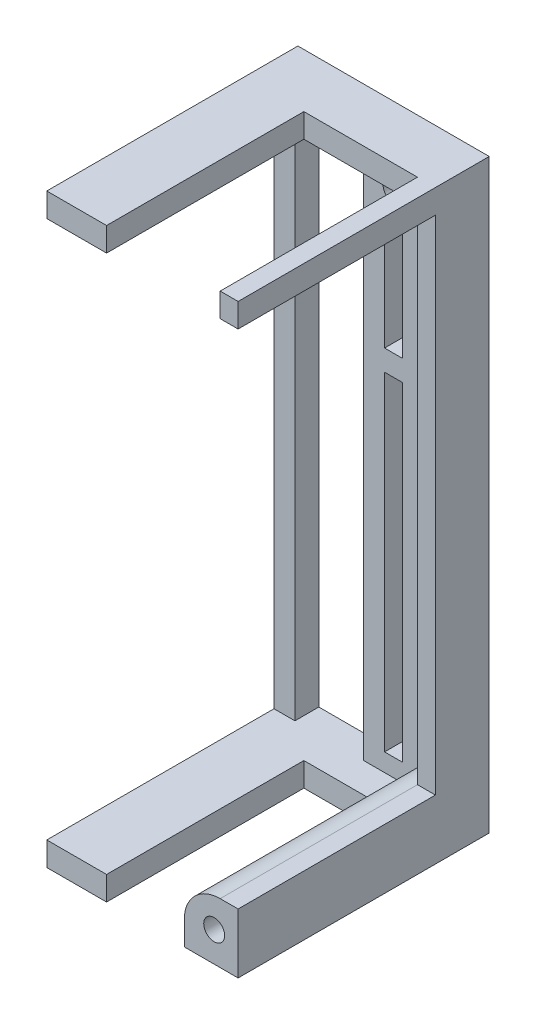
ISO-10303-21;
HEADER;
FILE_DESCRIPTION(('STEP AP214'),'2;1');
FILE_NAME('part.step','',(''),(''),'','','');
FILE_SCHEMA(('AUTOMOTIVE_DESIGN { 1 0 10303 214 1 1 1 1 }'));
ENDSEC;
DATA;
#1=APPLICATION_CONTEXT('core data for automotive mechanical design processes');
#2=APPLICATION_PROTOCOL_DEFINITION('international standard','automotive_design',2000,#1);
#3=PRODUCT_CONTEXT('',#1,'mechanical');
#4=PRODUCT('Part','Part','',(#3));
#5=PRODUCT_RELATED_PRODUCT_CATEGORY('part','',(#4));
#6=PRODUCT_DEFINITION_FORMATION('','',#4);
#7=PRODUCT_DEFINITION_CONTEXT('part definition',#1,'design');
#8=PRODUCT_DEFINITION('design','',#6,#7);
#9=PRODUCT_DEFINITION_SHAPE('','',#8);
#10=(LENGTH_UNIT() NAMED_UNIT(*) SI_UNIT(.MILLI.,.METRE.));
#11=(NAMED_UNIT(*) PLANE_ANGLE_UNIT() SI_UNIT($,.RADIAN.));
#12=(NAMED_UNIT(*) SI_UNIT($,.STERADIAN.) SOLID_ANGLE_UNIT());
#13=UNCERTAINTY_MEASURE_WITH_UNIT(LENGTH_MEASURE(1.E-05),#10,'distance_accuracy_value','');
#14=(GEOMETRIC_REPRESENTATION_CONTEXT(3) GLOBAL_UNCERTAINTY_ASSIGNED_CONTEXT((#13)) GLOBAL_UNIT_ASSIGNED_CONTEXT((#10,
#11,#12)) REPRESENTATION_CONTEXT('',''));
#15=CARTESIAN_POINT('',(0.,0.,0.));
#16=DIRECTION('',(0.,0.,1.));
#17=DIRECTION('',(1.,0.,0.));
#18=AXIS2_PLACEMENT_3D('',#15,#16,#17);
#19=CARTESIAN_POINT('',(0.,0.,-80.));
#20=DIRECTION('',(0.,0.,-1.));
#21=DIRECTION('',(1.,0.,0.));
#22=AXIS2_PLACEMENT_3D('',#19,#20,#21);
#23=PLANE('',#22);
#24=CARTESIAN_POINT('',(28.,5.,-80.));
#25=DIRECTION('',(0.,0.,-1.));
#26=DIRECTION('',(-1.,0.,0.));
#27=AXIS2_PLACEMENT_3D('',#24,#25,#26);
#28=CIRCLE('',#27,1.75);
#29=CARTESIAN_POINT('',(26.25,5.,-80.));
#30=VERTEX_POINT('',#29);
#31=EDGE_CURVE('E350',#30,#30,#28,.T.);
#32=ORIENTED_EDGE('',*,*,#31,.F.);
#33=EDGE_LOOP('',(#32));
#34=FACE_BOUND('',#33,.T.);
#35=DIRECTION('',(0.,1.,0.));
#36=VECTOR('',#35,1.);
#37=CARTESIAN_POINT('',(32.,0.,-80.));
#38=LINE('',#37,#36);
#39=CARTESIAN_POINT('',(32.,0.,-80.));
#40=VERTEX_POINT('',#39);
#41=CARTESIAN_POINT('',(32.,98.,-80.));
#42=VERTEX_POINT('',#41);
#43=EDGE_CURVE('E449',#40,#42,#38,.T.);
#44=ORIENTED_EDGE('',*,*,#43,.F.);
#45=DIRECTION('',(1.,0.,0.));
#46=VECTOR('',#45,1.);
#47=CARTESIAN_POINT('',(0.,0.,-80.));
#48=LINE('',#47,#46);
#49=CARTESIAN_POINT('',(0.,0.,-80.));
#50=VERTEX_POINT('',#49);
#51=EDGE_CURVE('E459',#50,#40,#48,.T.);
#52=ORIENTED_EDGE('',*,*,#51,.F.);
#53=DIRECTION('',(0.,1.,0.));
#54=VECTOR('',#53,1.);
#55=CARTESIAN_POINT('',(0.,0.,-80.));
#56=LINE('',#55,#54);
#57=CARTESIAN_POINT('',(0.,98.,-80.));
#58=VERTEX_POINT('',#57);
#59=EDGE_CURVE('E456',#50,#58,#56,.T.);
#60=ORIENTED_EDGE('',*,*,#59,.T.);
#61=DIRECTION('',(1.,0.,0.));
#62=VECTOR('',#61,1.);
#63=CARTESIAN_POINT('',(0.,98.,-80.));
#64=LINE('',#63,#62);
#65=EDGE_CURVE('E452',#58,#42,#64,.T.);
#66=ORIENTED_EDGE('',*,*,#65,.T.);
#67=EDGE_LOOP('',(#44,#52,#60,#66));
#68=FACE_BOUND('',#67,.T.);
#69=DIRECTION('',(0.,1.,0.));
#70=VECTOR('',#69,1.);
#71=CARTESIAN_POINT('',(21.5,0.,-80.));
#72=LINE('',#71,#70);
#73=CARTESIAN_POINT('',(21.5,7.,-80.));
#74=VERTEX_POINT('',#73);
#75=CARTESIAN_POINT('',(21.5,62.,-80.));
#76=VERTEX_POINT('',#75);
#77=EDGE_CURVE('E462',#74,#76,#72,.T.);
#78=ORIENTED_EDGE('',*,*,#77,.T.);
#79=DIRECTION('',(1.,0.,0.));
#80=VECTOR('',#79,1.);
#81=CARTESIAN_POINT('',(0.,62.,-80.));
#82=LINE('',#81,#80);
#83=CARTESIAN_POINT('',(18.5,62.,-80.));
#84=VERTEX_POINT('',#83);
#85=EDGE_CURVE('E471',#84,#76,#82,.T.);
#86=ORIENTED_EDGE('',*,*,#85,.F.);
#87=DIRECTION('',(0.,1.,0.));
#88=VECTOR('',#87,1.);
#89=CARTESIAN_POINT('',(18.5,0.,-80.));
#90=LINE('',#89,#88);
#91=CARTESIAN_POINT('',(18.5,7.,-80.));
#92=VERTEX_POINT('',#91);
#93=EDGE_CURVE('E468',#92,#84,#90,.T.);
#94=ORIENTED_EDGE('',*,*,#93,.F.);
#95=DIRECTION('',(-1.,0.,0.));
#96=VECTOR('',#95,1.);
#97=CARTESIAN_POINT('',(0.,7.,-80.));
#98=LINE('',#97,#96);
#99=EDGE_CURVE('E465',#74,#92,#98,.T.);
#100=ORIENTED_EDGE('',*,*,#99,.F.);
#101=EDGE_LOOP('',(#78,#86,#94,#100));
#102=FACE_BOUND('',#101,.T.);
#103=CARTESIAN_POINT('',(20.,89.,-80.));
#104=DIRECTION('',(0.,0.,1.));
#105=DIRECTION('',(1.,0.,0.));
#106=AXIS2_PLACEMENT_3D('',#103,#104,#105);
#107=CIRCLE('',#106,1.75);
#108=CARTESIAN_POINT('',(21.75,89.,-80.));
#109=VERTEX_POINT('',#108);
#110=EDGE_CURVE('E474',#109,#109,#107,.T.);
#111=ORIENTED_EDGE('',*,*,#110,.T.);
#112=EDGE_LOOP('',(#111));
#113=FACE_BOUND('',#112,.T.);
#114=DIRECTION('',(0.,-1.,0.));
#115=VECTOR('',#114,1.);
#116=CARTESIAN_POINT('',(29.,0.,-80.));
#117=LINE('',#116,#115);
#118=CARTESIAN_POINT('',(29.,94.,-80.));
#119=VERTEX_POINT('',#118);
#120=CARTESIAN_POINT('',(29.,10.,-80.));
#121=VERTEX_POINT('',#120);
#122=EDGE_CURVE('E337',#119,#121,#117,.T.);
#123=ORIENTED_EDGE('',*,*,#122,.F.);
#124=DIRECTION('',(1.,0.,0.));
#125=VECTOR('',#124,1.);
#126=CARTESIAN_POINT('',(0.,94.,-80.));
#127=LINE('',#126,#125);
#128=CARTESIAN_POINT('',(25.,94.,-80.));
#129=VERTEX_POINT('',#128);
#130=EDGE_CURVE('E334',#129,#119,#127,.T.);
#131=ORIENTED_EDGE('',*,*,#130,.F.);
#132=DIRECTION('',(0.,-1.,0.));
#133=VECTOR('',#132,1.);
#134=CARTESIAN_POINT('',(25.,0.,-80.));
#135=LINE('',#134,#133);
#136=CARTESIAN_POINT('',(25.,10.,-80.));
#137=VERTEX_POINT('',#136);
#138=EDGE_CURVE('E330',#129,#137,#135,.T.);
#139=ORIENTED_EDGE('',*,*,#138,.T.);
#140=DIRECTION('',(1.,0.,0.));
#141=VECTOR('',#140,1.);
#142=CARTESIAN_POINT('',(0.,10.,-80.));
#143=LINE('',#142,#141);
#144=EDGE_CURVE('E327',#137,#121,#143,.T.);
#145=ORIENTED_EDGE('',*,*,#144,.T.);
#146=EDGE_LOOP('',(#123,#131,#139,#145));
#147=FACE_BOUND('',#146,.T.);
#148=DIRECTION('',(1.,0.,0.));
#149=VECTOR('',#148,1.);
#150=CARTESIAN_POINT('',(0.,84.5,-80.));
#151=LINE('',#150,#149);
#152=CARTESIAN_POINT('',(18.5,84.5,-80.));
#153=VERTEX_POINT('',#152);
#154=CARTESIAN_POINT('',(21.5,84.5,-80.));
#155=VERTEX_POINT('',#154);
#156=EDGE_CURVE('E306',#153,#155,#151,.T.);
#157=ORIENTED_EDGE('',*,*,#156,.F.);
#158=DIRECTION('',(0.,1.,0.));
#159=VECTOR('',#158,1.);
#160=CARTESIAN_POINT('',(18.5,0.,-80.));
#161=LINE('',#160,#159);
#162=CARTESIAN_POINT('',(18.5,65.5,-80.));
#163=VERTEX_POINT('',#162);
#164=EDGE_CURVE('E304',#163,#153,#161,.T.);
#165=ORIENTED_EDGE('',*,*,#164,.F.);
#166=DIRECTION('',(1.,0.,0.));
#167=VECTOR('',#166,1.);
#168=CARTESIAN_POINT('',(0.,65.5,-80.));
#169=LINE('',#168,#167);
#170=CARTESIAN_POINT('',(21.5,65.5,-80.));
#171=VERTEX_POINT('',#170);
#172=EDGE_CURVE('E300',#163,#171,#169,.T.);
#173=ORIENTED_EDGE('',*,*,#172,.T.);
#174=DIRECTION('',(0.,1.,0.));
#175=VECTOR('',#174,1.);
#176=CARTESIAN_POINT('',(21.5,0.,-80.));
#177=LINE('',#176,#175);
#178=EDGE_CURVE('E297',#171,#155,#177,.T.);
#179=ORIENTED_EDGE('',*,*,#178,.T.);
#180=EDGE_LOOP('',(#157,#165,#173,#179));
#181=FACE_BOUND('',#180,.T.);
#182=DIRECTION('',(-1.,0.,0.));
#183=VECTOR('',#182,1.);
#184=CARTESIAN_POINT('',(0.,4.,-80.));
#185=LINE('',#184,#183);
#186=CARTESIAN_POINT('',(15.,4.,-80.));
#187=VERTEX_POINT('',#186);
#188=CARTESIAN_POINT('',(3.49999999999999,4.,-80.));
#189=VERTEX_POINT('',#188);
#190=EDGE_CURVE('E271',#187,#189,#185,.T.);
#191=ORIENTED_EDGE('',*,*,#190,.F.);
#192=DIRECTION('',(0.,-1.,0.));
#193=VECTOR('',#192,1.);
#194=CARTESIAN_POINT('',(15.,0.,-80.));
#195=LINE('',#194,#193);
#196=CARTESIAN_POINT('',(15.,94.,-80.));
#197=VERTEX_POINT('',#196);
#198=EDGE_CURVE('E282',#197,#187,#195,.T.);
#199=ORIENTED_EDGE('',*,*,#198,.F.);
#200=DIRECTION('',(1.,0.,0.));
#201=VECTOR('',#200,1.);
#202=CARTESIAN_POINT('',(0.,94.,-80.));
#203=LINE('',#202,#201);
#204=CARTESIAN_POINT('',(3.5,94.,-80.));
#205=VERTEX_POINT('',#204);
#206=EDGE_CURVE('E264',#205,#197,#203,.T.);
#207=ORIENTED_EDGE('',*,*,#206,.F.);
#208=DIRECTION('',(0.,-1.,0.));
#209=VECTOR('',#208,1.);
#210=CARTESIAN_POINT('',(3.49999999999999,0.,-80.));
#211=LINE('',#210,#209);
#212=EDGE_CURVE('E274',#205,#189,#211,.T.);
#213=ORIENTED_EDGE('',*,*,#212,.T.);
#214=EDGE_LOOP('',(#191,#199,#207,#213));
#215=FACE_BOUND('',#214,.T.);
#216=ADVANCED_FACE('F43',(#34,#68,#102,#113,#147,#181,#215),#23,.T.);
#217=CARTESIAN_POINT('',(0.,0.,-76.));
#218=DIRECTION('',(0.,0.,-1.));
#219=DIRECTION('',(1.,0.,0.));
#220=AXIS2_PLACEMENT_3D('',#217,#218,#219);
#221=PLANE('',#220);
#222=DIRECTION('',(0.,-1.,0.));
#223=VECTOR('',#222,1.);
#224=CARTESIAN_POINT('',(3.49999999999999,0.,-76.));
#225=LINE('',#224,#223);
#226=CARTESIAN_POINT('',(3.49999999999999,94.,-76.));
#227=VERTEX_POINT('',#226);
#228=CARTESIAN_POINT('',(3.49999999999999,4.,-76.));
#229=VERTEX_POINT('',#228);
#230=EDGE_CURVE('E287',#227,#229,#225,.T.);
#231=ORIENTED_EDGE('',*,*,#230,.F.);
#232=DIRECTION('',(1.,0.,0.));
#233=VECTOR('',#232,1.);
#234=CARTESIAN_POINT('',(0.,94.,-76.));
#235=LINE('',#234,#233);
#236=CARTESIAN_POINT('',(0.,94.,-76.));
#237=VERTEX_POINT('',#236);
#238=EDGE_CURVE('E267',#237,#227,#235,.T.);
#239=ORIENTED_EDGE('',*,*,#238,.F.);
#240=DIRECTION('',(0.,1.,0.));
#241=VECTOR('',#240,1.);
#242=CARTESIAN_POINT('',(0.,0.,-76.));
#243=LINE('',#242,#241);
#244=CARTESIAN_POINT('',(0.,4.,-76.));
#245=VERTEX_POINT('',#244);
#246=EDGE_CURVE('E440',#245,#237,#243,.T.);
#247=ORIENTED_EDGE('',*,*,#246,.F.);
#248=DIRECTION('',(1.,0.,0.));
#249=VECTOR('',#248,1.);
#250=CARTESIAN_POINT('',(0.,4.,-76.));
#251=LINE('',#250,#249);
#252=EDGE_CURVE('E419',#245,#229,#251,.T.);
#253=ORIENTED_EDGE('',*,*,#252,.T.);
#254=EDGE_LOOP('',(#231,#239,#247,#253));
#255=FACE_BOUND('',#254,.T.);
#256=ADVANCED_FACE('F600',(#255),#221,.F.);
#257=CARTESIAN_POINT('',(15.,4.,-76.));
#258=VERTEX_POINT('',#257);
#259=CARTESIAN_POINT('',(23.,4.,-76.));
#260=VERTEX_POINT('',#259);
#261=EDGE_CURVE('E435',#258,#260,#251,.T.);
#262=ORIENTED_EDGE('',*,*,#261,.T.);
#263=CARTESIAN_POINT('',(29.,4.,-76.));
#264=DIRECTION('',(0.,0.,1.));
#265=DIRECTION('',(1.,0.,0.));
#266=AXIS2_PLACEMENT_3D('',#263,#264,#265);
#267=CIRCLE('',#266,6.);
#268=CARTESIAN_POINT('',(29.,10.,-76.));
#269=VERTEX_POINT('',#268);
#270=EDGE_CURVE('E11',#260,#269,#267,.F.);
#271=ORIENTED_EDGE('',*,*,#270,.T.);
#272=DIRECTION('',(1.,0.,0.));
#273=VECTOR('',#272,1.);
#274=CARTESIAN_POINT('',(0.,10.,-76.));
#275=LINE('',#274,#273);
#276=CARTESIAN_POINT('',(25.,10.,-76.));
#277=VERTEX_POINT('',#276);
#278=EDGE_CURVE('E341',#277,#269,#275,.T.);
#279=ORIENTED_EDGE('',*,*,#278,.F.);
#280=DIRECTION('',(0.,-1.,0.));
#281=VECTOR('',#280,1.);
#282=CARTESIAN_POINT('',(25.,0.,-76.));
#283=LINE('',#282,#281);
#284=CARTESIAN_POINT('',(25.,94.,-76.));
#285=VERTEX_POINT('',#284);
#286=EDGE_CURVE('E331',#285,#277,#283,.T.);
#287=ORIENTED_EDGE('',*,*,#286,.F.);
#288=CARTESIAN_POINT('',(15.,94.,-76.));
#289=VERTEX_POINT('',#288);
#290=EDGE_CURVE('E413',#289,#285,#235,.T.);
#291=ORIENTED_EDGE('',*,*,#290,.F.);
#292=DIRECTION('',(0.,-1.,0.));
#293=VECTOR('',#292,1.);
#294=CARTESIAN_POINT('',(15.,0.,-76.));
#295=LINE('',#294,#293);
#296=EDGE_CURVE('E280',#289,#258,#295,.T.);
#297=ORIENTED_EDGE('',*,*,#296,.T.);
#298=EDGE_LOOP('',(#262,#271,#279,#287,#291,#297));
#299=FACE_BOUND('',#298,.T.);
#300=DIRECTION('',(0.,1.,0.));
#301=VECTOR('',#300,1.);
#302=CARTESIAN_POINT('',(21.5,0.,-76.));
#303=LINE('',#302,#301);
#304=CARTESIAN_POINT('',(21.5,7.,-76.));
#305=VERTEX_POINT('',#304);
#306=CARTESIAN_POINT('',(21.5,62.,-76.));
#307=VERTEX_POINT('',#306);
#308=EDGE_CURVE('E480',#305,#307,#303,.T.);
#309=ORIENTED_EDGE('',*,*,#308,.F.);
#310=DIRECTION('',(-1.,0.,0.));
#311=VECTOR('',#310,1.);
#312=CARTESIAN_POINT('',(0.,7.,-76.));
#313=LINE('',#312,#311);
#314=CARTESIAN_POINT('',(18.5,7.,-76.));
#315=VERTEX_POINT('',#314);
#316=EDGE_CURVE('E483',#305,#315,#313,.T.);
#317=ORIENTED_EDGE('',*,*,#316,.T.);
#318=DIRECTION('',(0.,1.,0.));
#319=VECTOR('',#318,1.);
#320=CARTESIAN_POINT('',(18.5,0.,-76.));
#321=LINE('',#320,#319);
#322=CARTESIAN_POINT('',(18.5,62.,-76.));
#323=VERTEX_POINT('',#322);
#324=EDGE_CURVE('E486',#315,#323,#321,.T.);
#325=ORIENTED_EDGE('',*,*,#324,.T.);
#326=DIRECTION('',(1.,0.,0.));
#327=VECTOR('',#326,1.);
#328=CARTESIAN_POINT('',(0.,62.,-76.));
#329=LINE('',#328,#327);
#330=EDGE_CURVE('E489',#323,#307,#329,.T.);
#331=ORIENTED_EDGE('',*,*,#330,.T.);
#332=EDGE_LOOP('',(#309,#317,#325,#331));
#333=FACE_BOUND('',#332,.T.);
#334=CARTESIAN_POINT('',(20.,89.,-76.));
#335=DIRECTION('',(0.,0.,1.));
#336=DIRECTION('',(1.,0.,0.));
#337=AXIS2_PLACEMENT_3D('',#334,#335,#336);
#338=CIRCLE('',#337,1.75);
#339=CARTESIAN_POINT('',(21.75,89.,-76.));
#340=VERTEX_POINT('',#339);
#341=EDGE_CURVE('E453',#340,#340,#338,.T.);
#342=ORIENTED_EDGE('',*,*,#341,.F.);
#343=EDGE_LOOP('',(#342));
#344=FACE_BOUND('',#343,.T.);
#345=DIRECTION('',(0.,1.,0.));
#346=VECTOR('',#345,1.);
#347=CARTESIAN_POINT('',(21.5,0.,-76.));
#348=LINE('',#347,#346);
#349=CARTESIAN_POINT('',(21.5,65.5,-76.));
#350=VERTEX_POINT('',#349);
#351=CARTESIAN_POINT('',(21.5,84.5,-76.));
#352=VERTEX_POINT('',#351);
#353=EDGE_CURVE('E310',#350,#352,#348,.T.);
#354=ORIENTED_EDGE('',*,*,#353,.F.);
#355=DIRECTION('',(1.,0.,0.));
#356=VECTOR('',#355,1.);
#357=CARTESIAN_POINT('',(0.,65.5,-76.));
#358=LINE('',#357,#356);
#359=CARTESIAN_POINT('',(18.5,65.5,-76.));
#360=VERTEX_POINT('',#359);
#361=EDGE_CURVE('E313',#360,#350,#358,.T.);
#362=ORIENTED_EDGE('',*,*,#361,.F.);
#363=DIRECTION('',(0.,1.,0.));
#364=VECTOR('',#363,1.);
#365=CARTESIAN_POINT('',(18.5,0.,-76.));
#366=LINE('',#365,#364);
#367=CARTESIAN_POINT('',(18.5,84.5,-76.));
#368=VERTEX_POINT('',#367);
#369=EDGE_CURVE('E317',#360,#368,#366,.T.);
#370=ORIENTED_EDGE('',*,*,#369,.T.);
#371=DIRECTION('',(1.,0.,0.));
#372=VECTOR('',#371,1.);
#373=CARTESIAN_POINT('',(0.,84.5,-76.));
#374=LINE('',#373,#372);
#375=EDGE_CURVE('E301',#368,#352,#374,.T.);
#376=ORIENTED_EDGE('',*,*,#375,.T.);
#377=EDGE_LOOP('',(#354,#362,#370,#376));
#378=FACE_BOUND('',#377,.T.);
#379=ADVANCED_FACE('F561',(#299,#333,#344,#378),#221,.F.);
#380=CARTESIAN_POINT('',(29.,4.,-71.));
#381=DIRECTION('',(0.,0.,-1.));
#382=DIRECTION('',(1.,0.,0.));
#383=AXIS2_PLACEMENT_3D('',#380,#381,#382);
#384=CYLINDRICAL_SURFACE('',#383,6.);
#385=DIRECTION('',(0.,0.,1.));
#386=VECTOR('',#385,1.);
#387=CARTESIAN_POINT('',(23.,4.,-71.));
#388=LINE('',#387,#386);
#389=CARTESIAN_POINT('',(23.,4.,-71.));
#390=VERTEX_POINT('',#389);
#391=CARTESIAN_POINT('',(23.,4.,-38.));
#392=VERTEX_POINT('',#391);
#393=EDGE_CURVE('E530',#390,#392,#388,.T.);
#394=ORIENTED_EDGE('',*,*,#393,.T.);
#395=CARTESIAN_POINT('',(29.,4.,-38.));
#396=DIRECTION('',(0.,0.,1.));
#397=DIRECTION('',(1.,0.,0.));
#398=AXIS2_PLACEMENT_3D('',#395,#396,#397);
#399=CIRCLE('',#398,6.);
#400=CARTESIAN_POINT('',(29.,10.,-38.));
#401=VERTEX_POINT('',#400);
#402=EDGE_CURVE('E51',#392,#401,#399,.F.);
#403=ORIENTED_EDGE('',*,*,#402,.T.);
#404=DIRECTION('',(0.,0.,1.));
#405=VECTOR('',#404,1.);
#406=CARTESIAN_POINT('',(29.,10.,-71.));
#407=LINE('',#406,#405);
#408=CARTESIAN_POINT('',(29.,10.,-71.));
#409=VERTEX_POINT('',#408);
#410=EDGE_CURVE('E533',#401,#409,#407,.F.);
#411=ORIENTED_EDGE('',*,*,#410,.T.);
#412=DIRECTION('',(0.,0.,-1.));
#413=VECTOR('',#412,1.);
#414=CARTESIAN_POINT('',(29.,10.,-71.));
#415=LINE('',#414,#413);
#416=EDGE_CURVE('E443',#409,#269,#415,.T.);
#417=ORIENTED_EDGE('',*,*,#416,.T.);
#418=ORIENTED_EDGE('',*,*,#270,.F.);
#419=DIRECTION('',(0.,0.,-1.));
#420=VECTOR('',#419,1.);
#421=CARTESIAN_POINT('',(23.,4.,-71.));
#422=LINE('',#421,#420);
#423=EDGE_CURVE('E441',#390,#260,#422,.T.);
#424=ORIENTED_EDGE('',*,*,#423,.F.);
#425=EDGE_LOOP('',(#394,#403,#411,#417,#418,#424));
#426=FACE_BOUND('',#425,.T.);
#427=ADVANCED_FACE('F45',(#426),#384,.T.);
#428=CARTESIAN_POINT('',(0.,0.,-71.));
#429=DIRECTION('',(0.,0.,-1.));
#430=DIRECTION('',(1.,0.,0.));
#431=AXIS2_PLACEMENT_3D('',#428,#429,#430);
#432=PLANE('',#431);
#433=DIRECTION('',(0.,1.,0.));
#434=VECTOR('',#433,1.);
#435=CARTESIAN_POINT('',(29.,0.,-71.));
#436=LINE('',#435,#434);
#437=CARTESIAN_POINT('',(29.,94.,-71.));
#438=VERTEX_POINT('',#437);
#439=CARTESIAN_POINT('',(29.,98.,-71.));
#440=VERTEX_POINT('',#439);
#441=EDGE_CURVE('E527',#438,#440,#436,.T.);
#442=ORIENTED_EDGE('',*,*,#441,.T.);
#443=DIRECTION('',(1.,0.,0.));
#444=VECTOR('',#443,1.);
#445=CARTESIAN_POINT('',(0.,98.,-71.));
#446=LINE('',#445,#444);
#447=CARTESIAN_POINT('',(10.,98.,-71.));
#448=VERTEX_POINT('',#447);
#449=EDGE_CURVE('E418',#448,#440,#446,.T.);
#450=ORIENTED_EDGE('',*,*,#449,.F.);
#451=DIRECTION('',(0.,1.,0.));
#452=VECTOR('',#451,1.);
#453=CARTESIAN_POINT('',(10.,0.,-71.));
#454=LINE('',#453,#452);
#455=CARTESIAN_POINT('',(10.,94.,-71.));
#456=VERTEX_POINT('',#455);
#457=EDGE_CURVE('E522',#456,#448,#454,.T.);
#458=ORIENTED_EDGE('',*,*,#457,.F.);
#459=DIRECTION('',(1.,0.,0.));
#460=VECTOR('',#459,1.);
#461=CARTESIAN_POINT('',(0.,94.,-71.));
#462=LINE('',#461,#460);
#463=EDGE_CURVE('E422',#456,#438,#462,.T.);
#464=ORIENTED_EDGE('',*,*,#463,.T.);
#465=EDGE_LOOP('',(#442,#450,#458,#464));
#466=FACE_BOUND('',#465,.T.);
#467=ADVANCED_FACE('F751',(#466),#432,.F.);
#468=DIRECTION('',(0.,1.,0.));
#469=VECTOR('',#468,1.);
#470=CARTESIAN_POINT('',(23.,0.,-71.));
#471=LINE('',#470,#469);
#472=CARTESIAN_POINT('',(23.,0.,-71.));
#473=VERTEX_POINT('',#472);
#474=EDGE_CURVE('E519',#473,#390,#471,.T.);
#475=ORIENTED_EDGE('',*,*,#474,.T.);
#476=DIRECTION('',(1.,0.,0.));
#477=VECTOR('',#476,1.);
#478=CARTESIAN_POINT('',(0.,4.,-71.));
#479=LINE('',#478,#477);
#480=CARTESIAN_POINT('',(10.,4.,-71.));
#481=VERTEX_POINT('',#480);
#482=EDGE_CURVE('E428',#481,#390,#479,.T.);
#483=ORIENTED_EDGE('',*,*,#482,.F.);
#484=DIRECTION('',(0.,1.,0.));
#485=VECTOR('',#484,1.);
#486=CARTESIAN_POINT('',(10.,0.,-71.));
#487=LINE('',#486,#485);
#488=CARTESIAN_POINT('',(10.,0.,-71.));
#489=VERTEX_POINT('',#488);
#490=EDGE_CURVE('E503',#489,#481,#487,.T.);
#491=ORIENTED_EDGE('',*,*,#490,.F.);
#492=DIRECTION('',(1.,0.,0.));
#493=VECTOR('',#492,1.);
#494=CARTESIAN_POINT('',(0.,0.,-71.));
#495=LINE('',#494,#493);
#496=EDGE_CURVE('E430',#489,#473,#495,.T.);
#497=ORIENTED_EDGE('',*,*,#496,.T.);
#498=EDGE_LOOP('',(#475,#483,#491,#497));
#499=FACE_BOUND('',#498,.T.);
#500=ADVANCED_FACE('F613',(#499),#432,.F.);
#501=CARTESIAN_POINT('',(21.5,0.,-80.));
#502=DIRECTION('',(-1.,0.,0.));
#503=DIRECTION('',(0.,0.,-1.));
#504=AXIS2_PLACEMENT_3D('',#501,#502,#503);
#505=PLANE('',#504);
#506=ORIENTED_EDGE('',*,*,#308,.T.);
#507=DIRECTION('',(0.,0.,1.));
#508=VECTOR('',#507,1.);
#509=CARTESIAN_POINT('',(21.5,62.,-80.));
#510=LINE('',#509,#508);
#511=EDGE_CURVE('E494',#76,#307,#510,.T.);
#512=ORIENTED_EDGE('',*,*,#511,.F.);
#513=ORIENTED_EDGE('',*,*,#77,.F.);
#514=DIRECTION('',(0.,0.,1.));
#515=VECTOR('',#514,1.);
#516=CARTESIAN_POINT('',(21.5,7.,-80.));
#517=LINE('',#516,#515);
#518=EDGE_CURVE('E501',#74,#305,#517,.T.);
#519=ORIENTED_EDGE('',*,*,#518,.T.);
#520=EDGE_LOOP('',(#506,#512,#513,#519));
#521=FACE_BOUND('',#520,.T.);
#522=ADVANCED_FACE('F665',(#521),#505,.T.);
#523=CARTESIAN_POINT('',(0.,7.,-80.));
#524=DIRECTION('',(0.,-1.,0.));
#525=DIRECTION('',(0.,0.,1.));
#526=AXIS2_PLACEMENT_3D('',#523,#524,#525);
#527=PLANE('',#526);
#528=ORIENTED_EDGE('',*,*,#316,.F.);
#529=ORIENTED_EDGE('',*,*,#518,.F.);
#530=ORIENTED_EDGE('',*,*,#99,.T.);
#531=DIRECTION('',(0.,0.,1.));
#532=VECTOR('',#531,1.);
#533=CARTESIAN_POINT('',(18.5,7.,-80.));
#534=LINE('',#533,#532);
#535=EDGE_CURVE('E499',#92,#315,#534,.T.);
#536=ORIENTED_EDGE('',*,*,#535,.T.);
#537=EDGE_LOOP('',(#528,#529,#530,#536));
#538=FACE_BOUND('',#537,.T.);
#539=ADVANCED_FACE('F661',(#538),#527,.F.);
#540=CARTESIAN_POINT('',(18.5,0.,-80.));
#541=DIRECTION('',(-1.,0.,0.));
#542=DIRECTION('',(0.,0.,-1.));
#543=AXIS2_PLACEMENT_3D('',#540,#541,#542);
#544=PLANE('',#543);
#545=ORIENTED_EDGE('',*,*,#324,.F.);
#546=ORIENTED_EDGE('',*,*,#535,.F.);
#547=ORIENTED_EDGE('',*,*,#93,.T.);
#548=DIRECTION('',(0.,0.,1.));
#549=VECTOR('',#548,1.);
#550=CARTESIAN_POINT('',(18.5,62.,-80.));
#551=LINE('',#550,#549);
#552=EDGE_CURVE('E496',#84,#323,#551,.T.);
#553=ORIENTED_EDGE('',*,*,#552,.T.);
#554=EDGE_LOOP('',(#545,#546,#547,#553));
#555=FACE_BOUND('',#554,.T.);
#556=ADVANCED_FACE('F658',(#555),#544,.F.);
#557=CARTESIAN_POINT('',(32.,0.,-80.));
#558=DIRECTION('',(-1.,0.,0.));
#559=DIRECTION('',(0.,0.,-1.));
#560=AXIS2_PLACEMENT_3D('',#557,#558,#559);
#561=PLANE('',#560);
#562=DIRECTION('',(0.,1.,0.));
#563=VECTOR('',#562,1.);
#564=CARTESIAN_POINT('',(32.,0.,-71.));
#565=LINE('',#564,#563);
#566=CARTESIAN_POINT('',(32.,10.,-71.));
#567=VERTEX_POINT('',#566);
#568=CARTESIAN_POINT('',(32.,94.,-71.));
#569=VERTEX_POINT('',#568);
#570=EDGE_CURVE('E415',#567,#569,#565,.T.);
#571=ORIENTED_EDGE('',*,*,#570,.F.);
#572=DIRECTION('',(0.,0.,-1.));
#573=VECTOR('',#572,1.);
#574=CARTESIAN_POINT('',(32.,10.,-38.));
#575=LINE('',#574,#573);
#576=CARTESIAN_POINT('',(32.,10.,-38.));
#577=VERTEX_POINT('',#576);
#578=EDGE_CURVE('E394',#577,#567,#575,.T.);
#579=ORIENTED_EDGE('',*,*,#578,.F.);
#580=DIRECTION('',(0.,1.,0.));
#581=VECTOR('',#580,1.);
#582=CARTESIAN_POINT('',(32.,0.,-38.));
#583=LINE('',#582,#581);
#584=CARTESIAN_POINT('',(32.,0.,-38.));
#585=VERTEX_POINT('',#584);
#586=EDGE_CURVE('E384',#585,#577,#583,.T.);
#587=ORIENTED_EDGE('',*,*,#586,.F.);
#588=DIRECTION('',(0.,0.,1.));
#589=VECTOR('',#588,1.);
#590=CARTESIAN_POINT('',(32.,0.,-80.));
#591=LINE('',#590,#589);
#592=EDGE_CURVE('E477',#40,#585,#591,.T.);
#593=ORIENTED_EDGE('',*,*,#592,.F.);
#594=ORIENTED_EDGE('',*,*,#43,.T.);
#595=DIRECTION('',(0.,0.,1.));
#596=VECTOR('',#595,1.);
#597=CARTESIAN_POINT('',(32.,98.,-80.));
#598=LINE('',#597,#596);
#599=CARTESIAN_POINT('',(32.,98.,-38.));
#600=VERTEX_POINT('',#599);
#601=EDGE_CURVE('E497',#42,#600,#598,.T.);
#602=ORIENTED_EDGE('',*,*,#601,.T.);
#603=DIRECTION('',(0.,1.,0.));
#604=VECTOR('',#603,1.);
#605=CARTESIAN_POINT('',(32.,0.,-38.));
#606=LINE('',#605,#604);
#607=CARTESIAN_POINT('',(32.,94.,-38.));
#608=VERTEX_POINT('',#607);
#609=EDGE_CURVE('E359',#608,#600,#606,.T.);
#610=ORIENTED_EDGE('',*,*,#609,.F.);
#611=DIRECTION('',(0.,0.,-1.));
#612=VECTOR('',#611,1.);
#613=CARTESIAN_POINT('',(32.,94.,-38.));
#614=LINE('',#613,#612);
#615=EDGE_CURVE('E368',#608,#569,#614,.T.);
#616=ORIENTED_EDGE('',*,*,#615,.T.);
#617=EDGE_LOOP('',(#571,#579,#587,#593,#594,#602,#610,#616));
#618=FACE_BOUND('',#617,.T.);
#619=ADVANCED_FACE('F578',(#618),#561,.F.);
#620=CARTESIAN_POINT('',(0.,98.,-80.));
#621=DIRECTION('',(0.,1.,0.));
#622=DIRECTION('',(0.,0.,-1.));
#623=AXIS2_PLACEMENT_3D('',#620,#621,#622);
#624=PLANE('',#623);
#625=DIRECTION('',(0.,0.,-1.));
#626=VECTOR('',#625,1.);
#627=CARTESIAN_POINT('',(29.,98.,-38.));
#628=LINE('',#627,#626);
#629=CARTESIAN_POINT('',(29.,98.,-38.));
#630=VERTEX_POINT('',#629);
#631=EDGE_CURVE('E365',#630,#440,#628,.T.);
#632=ORIENTED_EDGE('',*,*,#631,.F.);
#633=DIRECTION('',(1.,0.,0.));
#634=VECTOR('',#633,1.);
#635=CARTESIAN_POINT('',(0.,98.,-38.));
#636=LINE('',#635,#634);
#637=EDGE_CURVE('E362',#630,#600,#636,.T.);
#638=ORIENTED_EDGE('',*,*,#637,.T.);
#639=ORIENTED_EDGE('',*,*,#601,.F.);
#640=ORIENTED_EDGE('',*,*,#65,.F.);
#641=DIRECTION('',(0.,0.,1.));
#642=VECTOR('',#641,1.);
#643=CARTESIAN_POINT('',(0.,98.,-80.));
#644=LINE('',#643,#642);
#645=CARTESIAN_POINT('',(0.,98.,-38.));
#646=VERTEX_POINT('',#645);
#647=EDGE_CURVE('E509',#58,#646,#644,.T.);
#648=ORIENTED_EDGE('',*,*,#647,.T.);
#649=DIRECTION('',(1.,0.,0.));
#650=VECTOR('',#649,1.);
#651=CARTESIAN_POINT('',(0.,98.,-38.));
#652=LINE('',#651,#650);
#653=CARTESIAN_POINT('',(10.,98.,-38.));
#654=VERTEX_POINT('',#653);
#655=EDGE_CURVE('E376',#646,#654,#652,.T.);
#656=ORIENTED_EDGE('',*,*,#655,.T.);
#657=DIRECTION('',(0.,0.,-1.));
#658=VECTOR('',#657,1.);
#659=CARTESIAN_POINT('',(10.,98.,-38.));
#660=LINE('',#659,#658);
#661=EDGE_CURVE('E382',#654,#448,#660,.T.);
#662=ORIENTED_EDGE('',*,*,#661,.T.);
#663=ORIENTED_EDGE('',*,*,#449,.T.);
#664=EDGE_LOOP('',(#632,#638,#639,#640,#648,#656,#662,#663));
#665=FACE_BOUND('',#664,.T.);
#666=ADVANCED_FACE('F620',(#665),#624,.T.);
#667=CARTESIAN_POINT('',(0.,0.,-80.));
#668=DIRECTION('',(-1.,0.,0.));
#669=DIRECTION('',(0.,0.,-1.));
#670=AXIS2_PLACEMENT_3D('',#667,#668,#669);
#671=PLANE('',#670);
#672=ORIENTED_EDGE('',*,*,#647,.F.);
#673=ORIENTED_EDGE('',*,*,#59,.F.);
#674=DIRECTION('',(0.,0.,1.));
#675=VECTOR('',#674,1.);
#676=CARTESIAN_POINT('',(0.,0.,-80.));
#677=LINE('',#676,#675);
#678=CARTESIAN_POINT('',(0.,0.,-38.));
#679=VERTEX_POINT('',#678);
#680=EDGE_CURVE('E506',#50,#679,#677,.T.);
#681=ORIENTED_EDGE('',*,*,#680,.T.);
#682=DIRECTION('',(0.,1.,0.));
#683=VECTOR('',#682,1.);
#684=CARTESIAN_POINT('',(0.,0.,-38.));
#685=LINE('',#684,#683);
#686=CARTESIAN_POINT('',(0.,4.,-38.));
#687=VERTEX_POINT('',#686);
#688=EDGE_CURVE('E407',#679,#687,#685,.T.);
#689=ORIENTED_EDGE('',*,*,#688,.T.);
#690=DIRECTION('',(0.,0.,-1.));
#691=VECTOR('',#690,1.);
#692=CARTESIAN_POINT('',(0.,4.,-71.));
#693=LINE('',#692,#691);
#694=EDGE_CURVE('E438',#687,#245,#693,.T.);
#695=ORIENTED_EDGE('',*,*,#694,.T.);
#696=ORIENTED_EDGE('',*,*,#246,.T.);
#697=DIRECTION('',(0.,0.,-1.));
#698=VECTOR('',#697,1.);
#699=CARTESIAN_POINT('',(0.,94.,-71.));
#700=LINE('',#699,#698);
#701=CARTESIAN_POINT('',(0.,94.,-38.));
#702=VERTEX_POINT('',#701);
#703=EDGE_CURVE('E433',#702,#237,#700,.T.);
#704=ORIENTED_EDGE('',*,*,#703,.F.);
#705=DIRECTION('',(0.,1.,0.));
#706=VECTOR('',#705,1.);
#707=CARTESIAN_POINT('',(0.,0.,-38.));
#708=LINE('',#707,#706);
#709=EDGE_CURVE('E379',#702,#646,#708,.T.);
#710=ORIENTED_EDGE('',*,*,#709,.T.);
#711=EDGE_LOOP('',(#672,#673,#681,#689,#695,#696,#704,#710));
#712=FACE_BOUND('',#711,.T.);
#713=ADVANCED_FACE('F603',(#712),#671,.T.);
#714=CARTESIAN_POINT('',(0.,62.,-80.));
#715=DIRECTION('',(0.,1.,0.));
#716=DIRECTION('',(0.,0.,-1.));
#717=AXIS2_PLACEMENT_3D('',#714,#715,#716);
#718=PLANE('',#717);
#719=ORIENTED_EDGE('',*,*,#330,.F.);
#720=ORIENTED_EDGE('',*,*,#552,.F.);
#721=ORIENTED_EDGE('',*,*,#85,.T.);
#722=ORIENTED_EDGE('',*,*,#511,.T.);
#723=EDGE_LOOP('',(#719,#720,#721,#722));
#724=FACE_BOUND('',#723,.T.);
#725=ADVANCED_FACE('F654',(#724),#718,.F.);
#726=CARTESIAN_POINT('',(0.,0.,-80.));
#727=DIRECTION('',(0.,1.,0.));
#728=DIRECTION('',(-1.,0.,0.));
#729=AXIS2_PLACEMENT_3D('',#726,#727,#728);
#730=PLANE('',#729);
#731=ORIENTED_EDGE('',*,*,#496,.F.);
#732=DIRECTION('',(0.,0.,-1.));
#733=VECTOR('',#732,1.);
#734=CARTESIAN_POINT('',(10.,0.,-38.));
#735=LINE('',#734,#733);
#736=CARTESIAN_POINT('',(10.,0.,-38.));
#737=VERTEX_POINT('',#736);
#738=EDGE_CURVE('E410',#737,#489,#735,.T.);
#739=ORIENTED_EDGE('',*,*,#738,.F.);
#740=DIRECTION('',(1.,0.,0.));
#741=VECTOR('',#740,1.);
#742=CARTESIAN_POINT('',(0.,0.,-38.));
#743=LINE('',#742,#741);
#744=EDGE_CURVE('E397',#679,#737,#743,.T.);
#745=ORIENTED_EDGE('',*,*,#744,.F.);
#746=ORIENTED_EDGE('',*,*,#680,.F.);
#747=ORIENTED_EDGE('',*,*,#51,.T.);
#748=ORIENTED_EDGE('',*,*,#592,.T.);
#749=DIRECTION('',(1.,0.,0.));
#750=VECTOR('',#749,1.);
#751=CARTESIAN_POINT('',(0.,0.,-38.));
#752=LINE('',#751,#750);
#753=CARTESIAN_POINT('',(23.,0.,-38.));
#754=VERTEX_POINT('',#753);
#755=EDGE_CURVE('E392',#754,#585,#752,.T.);
#756=ORIENTED_EDGE('',*,*,#755,.F.);
#757=DIRECTION('',(0.,0.,-1.));
#758=VECTOR('',#757,1.);
#759=CARTESIAN_POINT('',(23.,0.,-38.));
#760=LINE('',#759,#758);
#761=EDGE_CURVE('E395',#754,#473,#760,.T.);
#762=ORIENTED_EDGE('',*,*,#761,.T.);
#763=EDGE_LOOP('',(#731,#739,#745,#746,#747,#748,#756,#762));
#764=FACE_BOUND('',#763,.T.);
#765=ADVANCED_FACE('F574',(#764),#730,.F.);
#766=CARTESIAN_POINT('',(20.,89.,-80.));
#767=DIRECTION('',(0.,0.,1.));
#768=DIRECTION('',(-1.,0.,0.));
#769=AXIS2_PLACEMENT_3D('',#766,#767,#768);
#770=CYLINDRICAL_SURFACE('',#769,1.75);
#771=ORIENTED_EDGE('',*,*,#110,.F.);
#772=EDGE_LOOP('',(#771));
#773=FACE_BOUND('',#772,.T.);
#774=ORIENTED_EDGE('',*,*,#341,.T.);
#775=EDGE_LOOP('',(#774));
#776=FACE_BOUND('',#775,.T.);
#777=ADVANCED_FACE('F650',(#773,#776),#770,.F.);
#778=CARTESIAN_POINT('',(0.,4.,-71.));
#779=DIRECTION('',(0.,-1.,0.));
#780=DIRECTION('',(0.,0.,1.));
#781=AXIS2_PLACEMENT_3D('',#778,#779,#780);
#782=PLANE('',#781);
#783=ORIENTED_EDGE('',*,*,#482,.T.);
#784=ORIENTED_EDGE('',*,*,#423,.T.);
#785=ORIENTED_EDGE('',*,*,#261,.F.);
#786=DIRECTION('',(0.,0.,1.));
#787=VECTOR('',#786,1.);
#788=CARTESIAN_POINT('',(15.,4.,-80.));
#789=LINE('',#788,#787);
#790=EDGE_CURVE('E294',#187,#258,#789,.T.);
#791=ORIENTED_EDGE('',*,*,#790,.F.);
#792=ORIENTED_EDGE('',*,*,#190,.T.);
#793=DIRECTION('',(0.,0.,1.));
#794=VECTOR('',#793,1.);
#795=CARTESIAN_POINT('',(3.49999999999999,4.,-80.));
#796=LINE('',#795,#794);
#797=EDGE_CURVE('E276',#189,#229,#796,.T.);
#798=ORIENTED_EDGE('',*,*,#797,.T.);
#799=ORIENTED_EDGE('',*,*,#252,.F.);
#800=ORIENTED_EDGE('',*,*,#694,.F.);
#801=DIRECTION('',(1.,0.,0.));
#802=VECTOR('',#801,1.);
#803=CARTESIAN_POINT('',(0.,4.,-38.));
#804=LINE('',#803,#802);
#805=CARTESIAN_POINT('',(10.,4.,-38.));
#806=VERTEX_POINT('',#805);
#807=EDGE_CURVE('E404',#687,#806,#804,.T.);
#808=ORIENTED_EDGE('',*,*,#807,.T.);
#809=DIRECTION('',(0.,0.,-1.));
#810=VECTOR('',#809,1.);
#811=CARTESIAN_POINT('',(10.,4.,-38.));
#812=LINE('',#811,#810);
#813=EDGE_CURVE('E411',#806,#481,#812,.T.);
#814=ORIENTED_EDGE('',*,*,#813,.T.);
#815=EDGE_LOOP('',(#783,#784,#785,#791,#792,#798,#799,#800,#808,#814));
#816=FACE_BOUND('',#815,.T.);
#817=ADVANCED_FACE('F566',(#816),#782,.F.);
#818=CARTESIAN_POINT('',(23.,0.,-71.));
#819=DIRECTION('',(1.,0.,0.));
#820=DIRECTION('',(0.,0.,1.));
#821=AXIS2_PLACEMENT_3D('',#818,#819,#820);
#822=PLANE('',#821);
#823=ORIENTED_EDGE('',*,*,#474,.F.);
#824=ORIENTED_EDGE('',*,*,#761,.F.);
#825=DIRECTION('',(0.,1.,0.));
#826=VECTOR('',#825,1.);
#827=CARTESIAN_POINT('',(23.,0.,-38.));
#828=LINE('',#827,#826);
#829=EDGE_CURVE('E390',#754,#392,#828,.T.);
#830=ORIENTED_EDGE('',*,*,#829,.T.);
#831=ORIENTED_EDGE('',*,*,#393,.F.);
#832=EDGE_LOOP('',(#823,#824,#830,#831));
#833=FACE_BOUND('',#832,.T.);
#834=ADVANCED_FACE('F570',(#833),#822,.F.);
#835=CARTESIAN_POINT('',(0.,10.,-71.));
#836=DIRECTION('',(0.,1.,0.));
#837=DIRECTION('',(0.,0.,-1.));
#838=AXIS2_PLACEMENT_3D('',#835,#836,#837);
#839=PLANE('',#838);
#840=DIRECTION('',(-1.,0.,0.));
#841=VECTOR('',#840,1.);
#842=CARTESIAN_POINT('',(0.,10.,-38.));
#843=LINE('',#842,#841);
#844=EDGE_CURVE('E388',#577,#401,#843,.T.);
#845=ORIENTED_EDGE('',*,*,#844,.F.);
#846=ORIENTED_EDGE('',*,*,#578,.T.);
#847=DIRECTION('',(-1.,0.,0.));
#848=VECTOR('',#847,1.);
#849=CARTESIAN_POINT('',(0.,10.,-71.));
#850=LINE('',#849,#848);
#851=EDGE_CURVE('E516',#567,#409,#850,.T.);
#852=ORIENTED_EDGE('',*,*,#851,.T.);
#853=ORIENTED_EDGE('',*,*,#410,.F.);
#854=EDGE_LOOP('',(#845,#846,#852,#853));
#855=FACE_BOUND('',#854,.T.);
#856=ADVANCED_FACE('F547',(#855),#839,.T.);
#857=CARTESIAN_POINT('',(29.,0.,-71.));
#858=DIRECTION('',(1.,0.,0.));
#859=DIRECTION('',(0.,0.,1.));
#860=AXIS2_PLACEMENT_3D('',#857,#858,#859);
#861=PLANE('',#860);
#862=ORIENTED_EDGE('',*,*,#416,.F.);
#863=DIRECTION('',(0.,1.,0.));
#864=VECTOR('',#863,1.);
#865=CARTESIAN_POINT('',(29.,0.,-71.));
#866=LINE('',#865,#864);
#867=EDGE_CURVE('E425',#409,#438,#866,.T.);
#868=ORIENTED_EDGE('',*,*,#867,.T.);
#869=DIRECTION('',(0.,0.,-1.));
#870=VECTOR('',#869,1.);
#871=CARTESIAN_POINT('',(29.,94.,-71.));
#872=LINE('',#871,#870);
#873=EDGE_CURVE('E446',#438,#119,#872,.T.);
#874=ORIENTED_EDGE('',*,*,#873,.T.);
#875=ORIENTED_EDGE('',*,*,#122,.T.);
#876=DIRECTION('',(0.,0.,1.));
#877=VECTOR('',#876,1.);
#878=CARTESIAN_POINT('',(29.,10.,-80.));
#879=LINE('',#878,#877);
#880=EDGE_CURVE('E314',#121,#269,#879,.T.);
#881=ORIENTED_EDGE('',*,*,#880,.T.);
#882=EDGE_LOOP('',(#862,#868,#874,#875,#881));
#883=FACE_BOUND('',#882,.T.);
#884=ADVANCED_FACE('F552',(#883),#861,.F.);
#885=CARTESIAN_POINT('',(0.,94.,-71.));
#886=DIRECTION('',(0.,-1.,0.));
#887=DIRECTION('',(0.,0.,1.));
#888=AXIS2_PLACEMENT_3D('',#885,#886,#887);
#889=PLANE('',#888);
#890=ORIENTED_EDGE('',*,*,#873,.F.);
#891=ORIENTED_EDGE('',*,*,#463,.F.);
#892=DIRECTION('',(0.,0.,-1.));
#893=VECTOR('',#892,1.);
#894=CARTESIAN_POINT('',(10.,94.,-38.));
#895=LINE('',#894,#893);
#896=CARTESIAN_POINT('',(10.,94.,-38.));
#897=VERTEX_POINT('',#896);
#898=EDGE_CURVE('E381',#897,#456,#895,.T.);
#899=ORIENTED_EDGE('',*,*,#898,.F.);
#900=DIRECTION('',(1.,0.,0.));
#901=VECTOR('',#900,1.);
#902=CARTESIAN_POINT('',(0.,94.,-38.));
#903=LINE('',#902,#901);
#904=EDGE_CURVE('E367',#702,#897,#903,.T.);
#905=ORIENTED_EDGE('',*,*,#904,.F.);
#906=ORIENTED_EDGE('',*,*,#703,.T.);
#907=ORIENTED_EDGE('',*,*,#238,.T.);
#908=DIRECTION('',(0.,0.,1.));
#909=VECTOR('',#908,1.);
#910=CARTESIAN_POINT('',(3.5,94.,-80.));
#911=LINE('',#910,#909);
#912=EDGE_CURVE('E259',#205,#227,#911,.T.);
#913=ORIENTED_EDGE('',*,*,#912,.F.);
#914=ORIENTED_EDGE('',*,*,#206,.T.);
#915=DIRECTION('',(0.,0.,1.));
#916=VECTOR('',#915,1.);
#917=CARTESIAN_POINT('',(15.,94.,-80.));
#918=LINE('',#917,#916);
#919=EDGE_CURVE('E58',#197,#289,#918,.T.);
#920=ORIENTED_EDGE('',*,*,#919,.T.);
#921=ORIENTED_EDGE('',*,*,#290,.T.);
#922=DIRECTION('',(0.,0.,1.));
#923=VECTOR('',#922,1.);
#924=CARTESIAN_POINT('',(25.,94.,-80.));
#925=LINE('',#924,#923);
#926=EDGE_CURVE('E347',#129,#285,#925,.T.);
#927=ORIENTED_EDGE('',*,*,#926,.F.);
#928=ORIENTED_EDGE('',*,*,#130,.T.);
#929=EDGE_LOOP('',(#890,#891,#899,#905,#906,#907,#913,#914,#920,#921,#927,#928));
#930=FACE_BOUND('',#929,.T.);
#931=ADVANCED_FACE('F262',(#930),#889,.T.);
#932=ORIENTED_EDGE('',*,*,#867,.F.);
#933=ORIENTED_EDGE('',*,*,#851,.F.);
#934=ORIENTED_EDGE('',*,*,#570,.T.);
#935=DIRECTION('',(1.,0.,0.));
#936=VECTOR('',#935,1.);
#937=CARTESIAN_POINT('',(0.,94.,-71.));
#938=LINE('',#937,#936);
#939=EDGE_CURVE('E525',#438,#569,#938,.T.);
#940=ORIENTED_EDGE('',*,*,#939,.F.);
#941=EDGE_LOOP('',(#932,#933,#934,#940));
#942=FACE_BOUND('',#941,.T.);
#943=ADVANCED_FACE('F582',(#942),#432,.F.);
#944=CARTESIAN_POINT('',(10.,0.,-38.));
#945=DIRECTION('',(1.,0.,0.));
#946=DIRECTION('',(0.,0.,1.));
#947=AXIS2_PLACEMENT_3D('',#944,#945,#946);
#948=PLANE('',#947);
#949=ORIENTED_EDGE('',*,*,#490,.T.);
#950=ORIENTED_EDGE('',*,*,#813,.F.);
#951=DIRECTION('',(0.,1.,0.));
#952=VECTOR('',#951,1.);
#953=CARTESIAN_POINT('',(10.,0.,-38.));
#954=LINE('',#953,#952);
#955=EDGE_CURVE('E402',#737,#806,#954,.T.);
#956=ORIENTED_EDGE('',*,*,#955,.F.);
#957=ORIENTED_EDGE('',*,*,#738,.T.);
#958=EDGE_LOOP('',(#949,#950,#956,#957));
#959=FACE_BOUND('',#958,.T.);
#960=ADVANCED_FACE('F610',(#959),#948,.T.);
#961=CARTESIAN_POINT('',(0.,0.,-38.));
#962=DIRECTION('',(0.,0.,-1.));
#963=DIRECTION('',(1.,0.,0.));
#964=AXIS2_PLACEMENT_3D('',#961,#962,#963);
#965=PLANE('',#964);
#966=ORIENTED_EDGE('',*,*,#744,.T.);
#967=ORIENTED_EDGE('',*,*,#955,.T.);
#968=ORIENTED_EDGE('',*,*,#807,.F.);
#969=ORIENTED_EDGE('',*,*,#688,.F.);
#970=EDGE_LOOP('',(#966,#967,#968,#969));
#971=FACE_BOUND('',#970,.T.);
#972=ADVANCED_FACE('F607',(#971),#965,.F.);
#973=CARTESIAN_POINT('',(0.,0.,-38.));
#974=DIRECTION('',(0.,0.,-1.));
#975=DIRECTION('',(1.,0.,0.));
#976=AXIS2_PLACEMENT_3D('',#973,#974,#975);
#977=PLANE('',#976);
#978=CARTESIAN_POINT('',(28.,5.,-38.));
#979=DIRECTION('',(0.,0.,-1.));
#980=DIRECTION('',(-1.,0.,0.));
#981=AXIS2_PLACEMENT_3D('',#978,#979,#980);
#982=CIRCLE('',#981,1.75);
#983=CARTESIAN_POINT('',(26.25,5.,-38.));
#984=VERTEX_POINT('',#983);
#985=EDGE_CURVE('E293',#984,#984,#982,.T.);
#986=ORIENTED_EDGE('',*,*,#985,.T.);
#987=EDGE_LOOP('',(#986));
#988=FACE_BOUND('',#987,.T.);
#989=ORIENTED_EDGE('',*,*,#829,.F.);
#990=ORIENTED_EDGE('',*,*,#755,.T.);
#991=ORIENTED_EDGE('',*,*,#586,.T.);
#992=ORIENTED_EDGE('',*,*,#844,.T.);
#993=ORIENTED_EDGE('',*,*,#402,.F.);
#994=EDGE_LOOP('',(#989,#990,#991,#992,#993));
#995=FACE_BOUND('',#994,.T.);
#996=ADVANCED_FACE('F542',(#988,#995),#977,.F.);
#997=CARTESIAN_POINT('',(10.,0.,-38.));
#998=DIRECTION('',(1.,0.,0.));
#999=DIRECTION('',(0.,0.,1.));
#1000=AXIS2_PLACEMENT_3D('',#997,#998,#999);
#1001=PLANE('',#1000);
#1002=ORIENTED_EDGE('',*,*,#457,.T.);
#1003=ORIENTED_EDGE('',*,*,#661,.F.);
#1004=DIRECTION('',(0.,1.,0.));
#1005=VECTOR('',#1004,1.);
#1006=CARTESIAN_POINT('',(10.,0.,-38.));
#1007=LINE('',#1006,#1005);
#1008=EDGE_CURVE('E374',#897,#654,#1007,.T.);
#1009=ORIENTED_EDGE('',*,*,#1008,.F.);
#1010=ORIENTED_EDGE('',*,*,#898,.T.);
#1011=EDGE_LOOP('',(#1002,#1003,#1009,#1010));
#1012=FACE_BOUND('',#1011,.T.);
#1013=ADVANCED_FACE('F771',(#1012),#1001,.T.);
#1014=CARTESIAN_POINT('',(0.,0.,-38.));
#1015=DIRECTION('',(0.,0.,-1.));
#1016=DIRECTION('',(1.,0.,0.));
#1017=AXIS2_PLACEMENT_3D('',#1014,#1015,#1016);
#1018=PLANE('',#1017);
#1019=ORIENTED_EDGE('',*,*,#904,.T.);
#1020=ORIENTED_EDGE('',*,*,#1008,.T.);
#1021=ORIENTED_EDGE('',*,*,#655,.F.);
#1022=ORIENTED_EDGE('',*,*,#709,.F.);
#1023=EDGE_LOOP('',(#1019,#1020,#1021,#1022));
#1024=FACE_BOUND('',#1023,.T.);
#1025=ADVANCED_FACE('F636',(#1024),#1018,.F.);
#1026=CARTESIAN_POINT('',(29.,0.,-38.));
#1027=DIRECTION('',(1.,0.,0.));
#1028=DIRECTION('',(0.,0.,1.));
#1029=AXIS2_PLACEMENT_3D('',#1026,#1027,#1028);
#1030=PLANE('',#1029);
#1031=DIRECTION('',(0.,0.,-1.));
#1032=VECTOR('',#1031,1.);
#1033=CARTESIAN_POINT('',(29.,94.,-38.));
#1034=LINE('',#1033,#1032);
#1035=CARTESIAN_POINT('',(29.,94.,-38.));
#1036=VERTEX_POINT('',#1035);
#1037=EDGE_CURVE('E364',#1036,#438,#1034,.T.);
#1038=ORIENTED_EDGE('',*,*,#1037,.F.);
#1039=DIRECTION('',(0.,1.,0.));
#1040=VECTOR('',#1039,1.);
#1041=CARTESIAN_POINT('',(29.,0.,-38.));
#1042=LINE('',#1041,#1040);
#1043=EDGE_CURVE('E353',#1036,#630,#1042,.T.);
#1044=ORIENTED_EDGE('',*,*,#1043,.T.);
#1045=ORIENTED_EDGE('',*,*,#631,.T.);
#1046=ORIENTED_EDGE('',*,*,#441,.F.);
#1047=EDGE_LOOP('',(#1038,#1044,#1045,#1046));
#1048=FACE_BOUND('',#1047,.T.);
#1049=ADVANCED_FACE('F628',(#1048),#1030,.F.);
#1050=CARTESIAN_POINT('',(0.,94.,-38.));
#1051=DIRECTION('',(0.,-1.,0.));
#1052=DIRECTION('',(0.,0.,1.));
#1053=AXIS2_PLACEMENT_3D('',#1050,#1051,#1052);
#1054=PLANE('',#1053);
#1055=ORIENTED_EDGE('',*,*,#939,.T.);
#1056=ORIENTED_EDGE('',*,*,#615,.F.);
#1057=DIRECTION('',(1.,0.,0.));
#1058=VECTOR('',#1057,1.);
#1059=CARTESIAN_POINT('',(0.,94.,-38.));
#1060=LINE('',#1059,#1058);
#1061=EDGE_CURVE('E357',#1036,#608,#1060,.T.);
#1062=ORIENTED_EDGE('',*,*,#1061,.F.);
#1063=ORIENTED_EDGE('',*,*,#1037,.T.);
#1064=EDGE_LOOP('',(#1055,#1056,#1062,#1063));
#1065=FACE_BOUND('',#1064,.T.);
#1066=ADVANCED_FACE('F626',(#1065),#1054,.T.);
#1067=CARTESIAN_POINT('',(0.,0.,-38.));
#1068=DIRECTION('',(0.,0.,-1.));
#1069=DIRECTION('',(1.,0.,0.));
#1070=AXIS2_PLACEMENT_3D('',#1067,#1068,#1069);
#1071=PLANE('',#1070);
#1072=ORIENTED_EDGE('',*,*,#1043,.F.);
#1073=ORIENTED_EDGE('',*,*,#1061,.T.);
#1074=ORIENTED_EDGE('',*,*,#609,.T.);
#1075=ORIENTED_EDGE('',*,*,#637,.F.);
#1076=EDGE_LOOP('',(#1072,#1073,#1074,#1075));
#1077=FACE_BOUND('',#1076,.T.);
#1078=ADVANCED_FACE('F624',(#1077),#1071,.F.);
#1079=CARTESIAN_POINT('',(28.,5.,-80.));
#1080=DIRECTION('',(0.,0.,1.));
#1081=DIRECTION('',(-1.,0.,0.));
#1082=AXIS2_PLACEMENT_3D('',#1079,#1080,#1081);
#1083=CYLINDRICAL_SURFACE('',#1082,1.75);
#1084=ORIENTED_EDGE('',*,*,#31,.T.);
#1085=EDGE_LOOP('',(#1084));
#1086=FACE_BOUND('',#1085,.T.);
#1087=ORIENTED_EDGE('',*,*,#985,.F.);
#1088=EDGE_LOOP('',(#1087));
#1089=FACE_BOUND('',#1088,.T.);
#1090=ADVANCED_FACE('F634',(#1086,#1089),#1083,.F.);
#1091=CARTESIAN_POINT('',(0.,10.,-80.));
#1092=DIRECTION('',(0.,1.,0.));
#1093=DIRECTION('',(0.,0.,-1.));
#1094=AXIS2_PLACEMENT_3D('',#1091,#1092,#1093);
#1095=PLANE('',#1094);
#1096=ORIENTED_EDGE('',*,*,#278,.T.);
#1097=ORIENTED_EDGE('',*,*,#880,.F.);
#1098=ORIENTED_EDGE('',*,*,#144,.F.);
#1099=DIRECTION('',(0.,0.,1.));
#1100=VECTOR('',#1099,1.);
#1101=CARTESIAN_POINT('',(25.,10.,-80.));
#1102=LINE('',#1101,#1100);
#1103=EDGE_CURVE('E340',#137,#277,#1102,.T.);
#1104=ORIENTED_EDGE('',*,*,#1103,.T.);
#1105=EDGE_LOOP('',(#1096,#1097,#1098,#1104));
#1106=FACE_BOUND('',#1105,.T.);
#1107=ADVANCED_FACE('F557',(#1106),#1095,.T.);
#1108=CARTESIAN_POINT('',(25.,0.,-80.));
#1109=DIRECTION('',(1.,0.,0.));
#1110=DIRECTION('',(0.,1.,0.));
#1111=AXIS2_PLACEMENT_3D('',#1108,#1109,#1110);
#1112=PLANE('',#1111);
#1113=ORIENTED_EDGE('',*,*,#286,.T.);
#1114=ORIENTED_EDGE('',*,*,#1103,.F.);
#1115=ORIENTED_EDGE('',*,*,#138,.F.);
#1116=ORIENTED_EDGE('',*,*,#926,.T.);
#1117=EDGE_LOOP('',(#1113,#1114,#1115,#1116));
#1118=FACE_BOUND('',#1117,.T.);
#1119=ADVANCED_FACE('F593',(#1118),#1112,.T.);
#1120=CARTESIAN_POINT('',(3.49999999999999,0.,-80.));
#1121=DIRECTION('',(1.,0.,0.));
#1122=DIRECTION('',(0.,1.,0.));
#1123=AXIS2_PLACEMENT_3D('',#1120,#1121,#1122);
#1124=PLANE('',#1123);
#1125=ORIENTED_EDGE('',*,*,#230,.T.);
#1126=ORIENTED_EDGE('',*,*,#797,.F.);
#1127=ORIENTED_EDGE('',*,*,#212,.F.);
#1128=ORIENTED_EDGE('',*,*,#912,.T.);
#1129=EDGE_LOOP('',(#1125,#1126,#1127,#1128));
#1130=FACE_BOUND('',#1129,.T.);
#1131=ADVANCED_FACE('F275',(#1130),#1124,.T.);
#1132=CARTESIAN_POINT('',(15.,0.,-80.));
#1133=DIRECTION('',(1.,0.,0.));
#1134=DIRECTION('',(0.,1.,0.));
#1135=AXIS2_PLACEMENT_3D('',#1132,#1133,#1134);
#1136=PLANE('',#1135);
#1137=ORIENTED_EDGE('',*,*,#296,.F.);
#1138=ORIENTED_EDGE('',*,*,#919,.F.);
#1139=ORIENTED_EDGE('',*,*,#198,.T.);
#1140=ORIENTED_EDGE('',*,*,#790,.T.);
#1141=EDGE_LOOP('',(#1137,#1138,#1139,#1140));
#1142=FACE_BOUND('',#1141,.T.);
#1143=ADVANCED_FACE('F595',(#1142),#1136,.F.);
#1144=CARTESIAN_POINT('',(21.5,0.,-80.));
#1145=DIRECTION('',(-1.,0.,0.));
#1146=DIRECTION('',(0.,0.,-1.));
#1147=AXIS2_PLACEMENT_3D('',#1144,#1145,#1146);
#1148=PLANE('',#1147);
#1149=ORIENTED_EDGE('',*,*,#353,.T.);
#1150=DIRECTION('',(0.,0.,1.));
#1151=VECTOR('',#1150,1.);
#1152=CARTESIAN_POINT('',(21.5,84.5,-80.));
#1153=LINE('',#1152,#1151);
#1154=EDGE_CURVE('E289',#155,#352,#1153,.T.);
#1155=ORIENTED_EDGE('',*,*,#1154,.F.);
#1156=ORIENTED_EDGE('',*,*,#178,.F.);
#1157=DIRECTION('',(0.,0.,1.));
#1158=VECTOR('',#1157,1.);
#1159=CARTESIAN_POINT('',(21.5,65.5,-80.));
#1160=LINE('',#1159,#1158);
#1161=EDGE_CURVE('E309',#171,#350,#1160,.T.);
#1162=ORIENTED_EDGE('',*,*,#1161,.T.);
#1163=EDGE_LOOP('',(#1149,#1155,#1156,#1162));
#1164=FACE_BOUND('',#1163,.T.);
#1165=ADVANCED_FACE('F833',(#1164),#1148,.T.);
#1166=CARTESIAN_POINT('',(0.,84.5,-80.));
#1167=DIRECTION('',(0.,1.,0.));
#1168=DIRECTION('',(0.,0.,-1.));
#1169=AXIS2_PLACEMENT_3D('',#1166,#1167,#1168);
#1170=PLANE('',#1169);
#1171=ORIENTED_EDGE('',*,*,#375,.F.);
#1172=DIRECTION('',(0.,0.,1.));
#1173=VECTOR('',#1172,1.);
#1174=CARTESIAN_POINT('',(18.5,84.5,-80.));
#1175=LINE('',#1174,#1173);
#1176=EDGE_CURVE('E323',#153,#368,#1175,.T.);
#1177=ORIENTED_EDGE('',*,*,#1176,.F.);
#1178=ORIENTED_EDGE('',*,*,#156,.T.);
#1179=ORIENTED_EDGE('',*,*,#1154,.T.);
#1180=EDGE_LOOP('',(#1171,#1177,#1178,#1179));
#1181=FACE_BOUND('',#1180,.T.);
#1182=ADVANCED_FACE('F843',(#1181),#1170,.F.);
#1183=CARTESIAN_POINT('',(18.5,0.,-80.));
#1184=DIRECTION('',(-1.,0.,0.));
#1185=DIRECTION('',(0.,0.,-1.));
#1186=AXIS2_PLACEMENT_3D('',#1183,#1184,#1185);
#1187=PLANE('',#1186);
#1188=ORIENTED_EDGE('',*,*,#369,.F.);
#1189=DIRECTION('',(0.,0.,1.));
#1190=VECTOR('',#1189,1.);
#1191=CARTESIAN_POINT('',(18.5,65.5,-80.));
#1192=LINE('',#1191,#1190);
#1193=EDGE_CURVE('E66',#163,#360,#1192,.T.);
#1194=ORIENTED_EDGE('',*,*,#1193,.F.);
#1195=ORIENTED_EDGE('',*,*,#164,.T.);
#1196=ORIENTED_EDGE('',*,*,#1176,.T.);
#1197=EDGE_LOOP('',(#1188,#1194,#1195,#1196));
#1198=FACE_BOUND('',#1197,.T.);
#1199=ADVANCED_FACE('F851',(#1198),#1187,.F.);
#1200=CARTESIAN_POINT('',(0.,65.5,-80.));
#1201=DIRECTION('',(0.,1.,0.));
#1202=DIRECTION('',(0.,0.,-1.));
#1203=AXIS2_PLACEMENT_3D('',#1200,#1201,#1202);
#1204=PLANE('',#1203);
#1205=ORIENTED_EDGE('',*,*,#361,.T.);
#1206=ORIENTED_EDGE('',*,*,#1161,.F.);
#1207=ORIENTED_EDGE('',*,*,#172,.F.);
#1208=ORIENTED_EDGE('',*,*,#1193,.T.);
#1209=EDGE_LOOP('',(#1205,#1206,#1207,#1208));
#1210=FACE_BOUND('',#1209,.T.);
#1211=ADVANCED_FACE('F859',(#1210),#1204,.T.);
#1212=CLOSED_SHELL('',(#216,#256,#379,#427,#467,#500,#522,#539,#556,#619,#666,#713,#725,#765,
#777,#817,#834,#856,#884,#931,#943,#960,#972,#996,#1013,#1025,#1049,#1066,#1078,#1090,#1107,
#1119,#1131,#1143,#1165,#1182,#1199,#1211));
#1213=MANIFOLD_SOLID_BREP('B2',#1212);
#1214=ADVANCED_BREP_SHAPE_REPRESENTATION('',(#18,#1213),#14);
#1215=SHAPE_DEFINITION_REPRESENTATION(#9,#1214);
ENDSEC;
END-ISO-10303-21;
